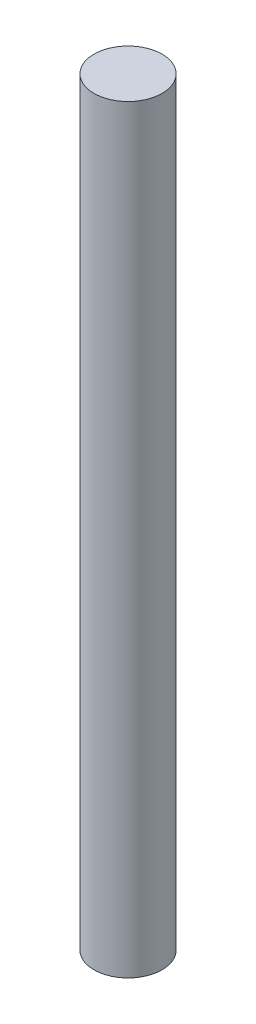
ISO-10303-21;
HEADER;
FILE_DESCRIPTION(('STEP AP214'),'2;1');
FILE_NAME('part.step','',(''),(''),'','','');
FILE_SCHEMA(('AUTOMOTIVE_DESIGN { 1 0 10303 214 1 1 1 1 }'));
ENDSEC;
DATA;
#1=APPLICATION_CONTEXT('core data for automotive mechanical design processes');
#2=APPLICATION_PROTOCOL_DEFINITION('international standard','automotive_design',2000,#1);
#3=PRODUCT_CONTEXT('',#1,'mechanical');
#4=PRODUCT('Part','Part','',(#3));
#5=PRODUCT_RELATED_PRODUCT_CATEGORY('part','',(#4));
#6=PRODUCT_DEFINITION_FORMATION('','',#4);
#7=PRODUCT_DEFINITION_CONTEXT('part definition',#1,'design');
#8=PRODUCT_DEFINITION('design','',#6,#7);
#9=PRODUCT_DEFINITION_SHAPE('','',#8);
#10=(LENGTH_UNIT() NAMED_UNIT(*) SI_UNIT(.MILLI.,.METRE.));
#11=(NAMED_UNIT(*) PLANE_ANGLE_UNIT() SI_UNIT($,.RADIAN.));
#12=(NAMED_UNIT(*) SI_UNIT($,.STERADIAN.) SOLID_ANGLE_UNIT());
#13=UNCERTAINTY_MEASURE_WITH_UNIT(LENGTH_MEASURE(1.E-05),#10,'distance_accuracy_value','');
#14=(GEOMETRIC_REPRESENTATION_CONTEXT(3) GLOBAL_UNCERTAINTY_ASSIGNED_CONTEXT((#13)) GLOBAL_UNIT_ASSIGNED_CONTEXT((#10,
#11,#12)) REPRESENTATION_CONTEXT('',''));
#15=CARTESIAN_POINT('',(0.,0.,0.));
#16=DIRECTION('',(0.,0.,1.));
#17=DIRECTION('',(1.,0.,0.));
#18=AXIS2_PLACEMENT_3D('',#15,#16,#17);
#19=CARTESIAN_POINT('',(0.,0.,0.));
#20=DIRECTION('',(0.,1.,0.));
#21=DIRECTION('',(0.,0.,1.));
#22=AXIS2_PLACEMENT_3D('',#19,#20,#21);
#23=PLANE('',#22);
#24=CARTESIAN_POINT('',(0.,0.,0.));
#25=DIRECTION('',(0.,-1.,0.));
#26=DIRECTION('',(0.,0.,-1.));
#27=AXIS2_PLACEMENT_3D('',#24,#25,#26);
#28=CIRCLE('',#27,1.3);
#29=CARTESIAN_POINT('',(0.,0.,-1.3));
#30=VERTEX_POINT('',#29);
#31=EDGE_CURVE('E10',#30,#30,#28,.T.);
#32=ORIENTED_EDGE('',*,*,#31,.F.);
#33=EDGE_LOOP('',(#32));
#34=FACE_BOUND('',#33,.T.);
#35=ADVANCED_FACE('F31',(#34),#23,.T.);
#36=CARTESIAN_POINT('',(0.,-33.,0.));
#37=DIRECTION('',(0.,-1.,0.));
#38=DIRECTION('',(0.,0.,-1.));
#39=AXIS2_PLACEMENT_3D('',#36,#37,#38);
#40=CYLINDRICAL_SURFACE('',#39,1.3);
#41=ORIENTED_EDGE('',*,*,#31,.T.);
#42=EDGE_LOOP('',(#41));
#43=FACE_BOUND('',#42,.T.);
#44=CARTESIAN_POINT('',(0.,-29.,0.));
#45=DIRECTION('',(0.,-1.,0.));
#46=DIRECTION('',(0.,0.,-1.));
#47=AXIS2_PLACEMENT_3D('',#44,#45,#46);
#48=CIRCLE('',#47,1.3);
#49=CARTESIAN_POINT('',(0.,-29.,-1.3));
#50=VERTEX_POINT('',#49);
#51=EDGE_CURVE('E37',#50,#50,#48,.T.);
#52=ORIENTED_EDGE('',*,*,#51,.F.);
#53=EDGE_LOOP('',(#52));
#54=FACE_BOUND('',#53,.T.);
#55=ADVANCED_FACE('F45',(#43,#54),#40,.T.);
#56=CARTESIAN_POINT('',(1.3,-29.,0.));
#57=DIRECTION('',(0.,-1.,0.));
#58=DIRECTION('',(0.,0.,-1.));
#59=AXIS2_PLACEMENT_3D('',#56,#57,#58);
#60=PLANE('',#59);
#61=ORIENTED_EDGE('',*,*,#51,.T.);
#62=EDGE_LOOP('',(#61));
#63=FACE_BOUND('',#62,.T.);
#64=ADVANCED_FACE('F43',(#63),#60,.T.);
#65=CLOSED_SHELL('',(#35,#55,#64));
#66=MANIFOLD_SOLID_BREP('B2',#65);
#67=ADVANCED_BREP_SHAPE_REPRESENTATION('',(#18,#66),#14);
#68=SHAPE_DEFINITION_REPRESENTATION(#9,#67);
ENDSEC;
END-ISO-10303-21;
